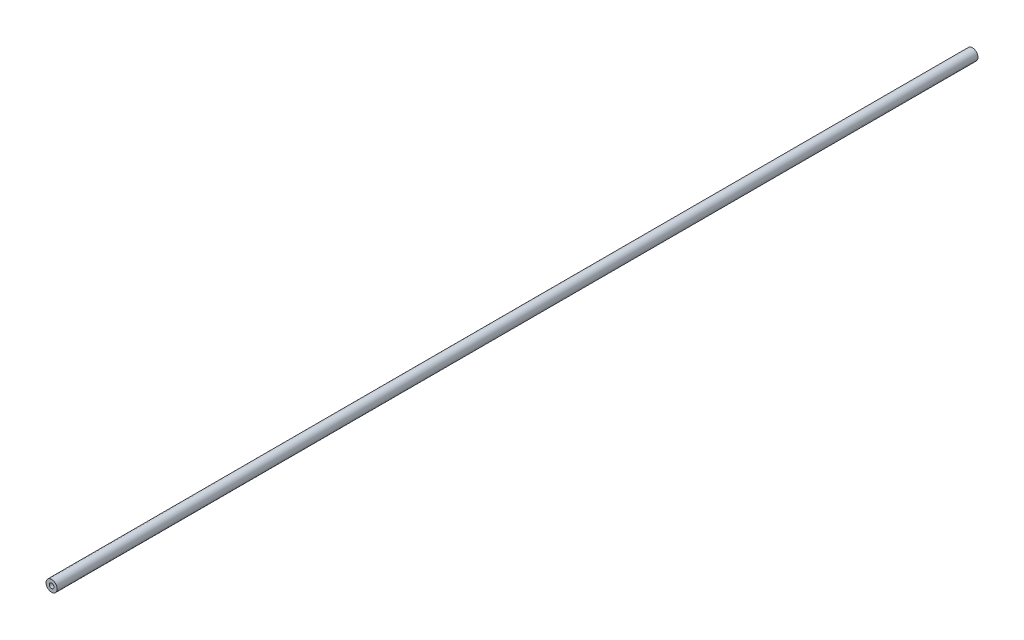
ISO-10303-21;
HEADER;
FILE_DESCRIPTION(('STEP AP214'),'2;1');
FILE_NAME('part.step','',(''),(''),'','','');
FILE_SCHEMA(('AUTOMOTIVE_DESIGN { 1 0 10303 214 1 1 1 1 }'));
ENDSEC;
DATA;
#1=APPLICATION_CONTEXT('core data for automotive mechanical design processes');
#2=APPLICATION_PROTOCOL_DEFINITION('international standard','automotive_design',2000,#1);
#3=PRODUCT_CONTEXT('',#1,'mechanical');
#4=PRODUCT('Part','Part','',(#3));
#5=PRODUCT_RELATED_PRODUCT_CATEGORY('part','',(#4));
#6=PRODUCT_DEFINITION_FORMATION('','',#4);
#7=PRODUCT_DEFINITION_CONTEXT('part definition',#1,'design');
#8=PRODUCT_DEFINITION('design','',#6,#7);
#9=PRODUCT_DEFINITION_SHAPE('','',#8);
#10=(LENGTH_UNIT() NAMED_UNIT(*) SI_UNIT(.MILLI.,.METRE.));
#11=(NAMED_UNIT(*) PLANE_ANGLE_UNIT() SI_UNIT($,.RADIAN.));
#12=(NAMED_UNIT(*) SI_UNIT($,.STERADIAN.) SOLID_ANGLE_UNIT());
#13=UNCERTAINTY_MEASURE_WITH_UNIT(LENGTH_MEASURE(1.E-05),#10,'distance_accuracy_value','');
#14=(GEOMETRIC_REPRESENTATION_CONTEXT(3) GLOBAL_UNCERTAINTY_ASSIGNED_CONTEXT((#13)) GLOBAL_UNIT_ASSIGNED_CONTEXT((#10,
#11,#12)) REPRESENTATION_CONTEXT('',''));
#15=CARTESIAN_POINT('',(0.,0.,0.));
#16=DIRECTION('',(0.,0.,1.));
#17=DIRECTION('',(1.,0.,0.));
#18=AXIS2_PLACEMENT_3D('',#15,#16,#17);
#19=CARTESIAN_POINT('',(0.,0.,495.));
#20=DIRECTION('',(0.,0.,-1.));
#21=DIRECTION('',(-1.,0.,0.));
#22=AXIS2_PLACEMENT_3D('',#19,#20,#21);
#23=CYLINDRICAL_SURFACE('',#22,6.);
#24=CARTESIAN_POINT('',(0.,0.,495.));
#25=DIRECTION('',(0.,0.,1.));
#26=DIRECTION('',(1.,0.,0.));
#27=AXIS2_PLACEMENT_3D('',#24,#25,#26);
#28=CIRCLE('',#27,6.);
#29=CARTESIAN_POINT('',(6.,0.,495.));
#30=VERTEX_POINT('',#29);
#31=EDGE_CURVE('E11',#30,#30,#28,.T.);
#32=ORIENTED_EDGE('',*,*,#31,.F.);
#33=EDGE_LOOP('',(#32));
#34=FACE_BOUND('',#33,.T.);
#35=CARTESIAN_POINT('',(0.,0.,-495.));
#36=DIRECTION('',(0.,0.,1.));
#37=DIRECTION('',(1.,0.,0.));
#38=AXIS2_PLACEMENT_3D('',#35,#36,#37);
#39=CIRCLE('',#38,6.);
#40=CARTESIAN_POINT('',(6.,0.,-495.));
#41=VERTEX_POINT('',#40);
#42=EDGE_CURVE('E46',#41,#41,#39,.T.);
#43=ORIENTED_EDGE('',*,*,#42,.T.);
#44=EDGE_LOOP('',(#43));
#45=FACE_BOUND('',#44,.T.);
#46=ADVANCED_FACE('F43',(#34,#45),#23,.T.);
#47=CARTESIAN_POINT('',(0.,0.,495.));
#48=DIRECTION('',(0.,0.,1.));
#49=DIRECTION('',(1.,0.,0.));
#50=AXIS2_PLACEMENT_3D('',#47,#48,#49);
#51=PLANE('',#50);
#52=CARTESIAN_POINT('',(0.,0.,495.));
#53=DIRECTION('',(0.,0.,1.));
#54=DIRECTION('',(1.,0.,0.));
#55=AXIS2_PLACEMENT_3D('',#52,#53,#54);
#56=CIRCLE('',#55,2.49999999999999);
#57=CARTESIAN_POINT('',(2.49999999999999,0.,495.));
#58=VERTEX_POINT('',#57);
#59=EDGE_CURVE('E69',#58,#58,#56,.T.);
#60=ORIENTED_EDGE('',*,*,#59,.F.);
#61=EDGE_LOOP('',(#60));
#62=FACE_BOUND('',#61,.T.);
#63=ORIENTED_EDGE('',*,*,#31,.T.);
#64=EDGE_LOOP('',(#63));
#65=FACE_BOUND('',#64,.T.);
#66=ADVANCED_FACE('F91',(#62,#65),#51,.T.);
#67=CARTESIAN_POINT('',(0.,0.,-495.));
#68=DIRECTION('',(0.,0.,1.));
#69=DIRECTION('',(1.,0.,0.));
#70=AXIS2_PLACEMENT_3D('',#67,#68,#69);
#71=PLANE('',#70);
#72=CARTESIAN_POINT('',(0.,0.,-495.));
#73=DIRECTION('',(0.,0.,-1.));
#74=DIRECTION('',(-1.,0.,0.));
#75=AXIS2_PLACEMENT_3D('',#72,#73,#74);
#76=CIRCLE('',#75,2.5);
#77=CARTESIAN_POINT('',(-2.5,0.,-495.));
#78=VERTEX_POINT('',#77);
#79=EDGE_CURVE('E68',#78,#78,#76,.T.);
#80=ORIENTED_EDGE('',*,*,#79,.F.);
#81=EDGE_LOOP('',(#80));
#82=FACE_BOUND('',#81,.T.);
#83=ORIENTED_EDGE('',*,*,#42,.F.);
#84=EDGE_LOOP('',(#83));
#85=FACE_BOUND('',#84,.T.);
#86=ADVANCED_FACE('F88',(#82,#85),#71,.F.);
#87=CARTESIAN_POINT('',(0.,0.,-480.));
#88=DIRECTION('',(0.,0.,-1.));
#89=DIRECTION('',(-1.,0.,0.));
#90=AXIS2_PLACEMENT_3D('',#87,#88,#89);
#91=CONICAL_SURFACE('',#90,2.5,1.02974425867666);
#92=CARTESIAN_POINT('',(0.,0.,-478.497848452431));
#93=VERTEX_POINT('',#92);
#94=VERTEX_LOOP('',#93);
#95=FACE_BOUND('',#94,.T.);
#96=CARTESIAN_POINT('',(0.,0.,-480.));
#97=DIRECTION('',(0.,0.,-1.));
#98=DIRECTION('',(-1.,0.,0.));
#99=AXIS2_PLACEMENT_3D('',#96,#97,#98);
#100=CIRCLE('',#99,2.5);
#101=CARTESIAN_POINT('',(-2.5,0.,-480.));
#102=VERTEX_POINT('',#101);
#103=EDGE_CURVE('E74',#102,#102,#100,.T.);
#104=ORIENTED_EDGE('',*,*,#103,.T.);
#105=EDGE_LOOP('',(#104));
#106=FACE_BOUND('',#105,.T.);
#107=ADVANCED_FACE('F90',(#95,#106),#91,.F.);
#108=CARTESIAN_POINT('',(0.,0.,-495.));
#109=DIRECTION('',(0.,0.,-1.));
#110=DIRECTION('',(-1.,0.,0.));
#111=AXIS2_PLACEMENT_3D('',#108,#109,#110);
#112=CYLINDRICAL_SURFACE('',#111,2.5);
#113=ORIENTED_EDGE('',*,*,#103,.F.);
#114=EDGE_LOOP('',(#113));
#115=FACE_BOUND('',#114,.T.);
#116=ORIENTED_EDGE('',*,*,#79,.T.);
#117=EDGE_LOOP('',(#116));
#118=FACE_BOUND('',#117,.T.);
#119=ADVANCED_FACE('F61',(#115,#118),#112,.F.);
#120=CARTESIAN_POINT('',(0.,0.,480.));
#121=DIRECTION('',(0.,0.,1.));
#122=DIRECTION('',(1.,0.,0.));
#123=AXIS2_PLACEMENT_3D('',#120,#121,#122);
#124=CONICAL_SURFACE('',#123,2.49999999999999,1.02974425867666);
#125=CARTESIAN_POINT('',(0.,0.,478.497848452431));
#126=VERTEX_POINT('',#125);
#127=VERTEX_LOOP('',#126);
#128=FACE_BOUND('',#127,.T.);
#129=CARTESIAN_POINT('',(0.,0.,480.));
#130=DIRECTION('',(0.,0.,1.));
#131=DIRECTION('',(1.,0.,0.));
#132=AXIS2_PLACEMENT_3D('',#129,#130,#131);
#133=CIRCLE('',#132,2.49999999999999);
#134=CARTESIAN_POINT('',(2.49999999999999,0.,480.));
#135=VERTEX_POINT('',#134);
#136=EDGE_CURVE('E65',#135,#135,#133,.T.);
#137=ORIENTED_EDGE('',*,*,#136,.T.);
#138=EDGE_LOOP('',(#137));
#139=FACE_BOUND('',#138,.T.);
#140=ADVANCED_FACE('F57',(#128,#139),#124,.F.);
#141=CARTESIAN_POINT('',(0.,0.,495.));
#142=DIRECTION('',(0.,0.,1.));
#143=DIRECTION('',(1.,0.,0.));
#144=AXIS2_PLACEMENT_3D('',#141,#142,#143);
#145=CYLINDRICAL_SURFACE('',#144,2.49999999999999);
#146=ORIENTED_EDGE('',*,*,#136,.F.);
#147=EDGE_LOOP('',(#146));
#148=FACE_BOUND('',#147,.T.);
#149=ORIENTED_EDGE('',*,*,#59,.T.);
#150=EDGE_LOOP('',(#149));
#151=FACE_BOUND('',#150,.T.);
#152=ADVANCED_FACE('F60',(#148,#151),#145,.F.);
#153=CLOSED_SHELL('',(#46,#66,#86,#107,#119,#140,#152));
#154=MANIFOLD_SOLID_BREP('B2',#153);
#155=ADVANCED_BREP_SHAPE_REPRESENTATION('',(#18,#154),#14);
#156=SHAPE_DEFINITION_REPRESENTATION(#9,#155);
ENDSEC;
END-ISO-10303-21;
